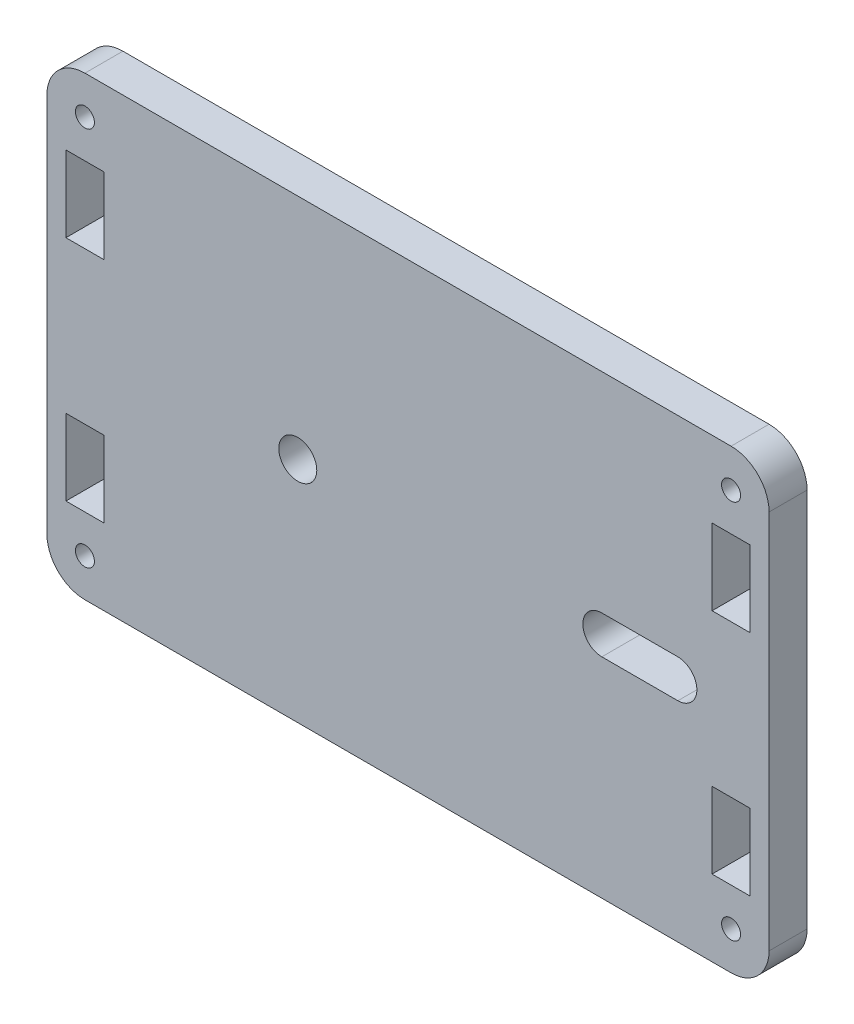
ISO-10303-21;
HEADER;
FILE_DESCRIPTION(('STEP AP214'),'2;1');
FILE_NAME('part.step','',(''),(''),'','','');
FILE_SCHEMA(('AUTOMOTIVE_DESIGN { 1 0 10303 214 1 1 1 1 }'));
ENDSEC;
DATA;
#1=APPLICATION_CONTEXT('core data for automotive mechanical design processes');
#2=APPLICATION_PROTOCOL_DEFINITION('international standard','automotive_design',2000,#1);
#3=PRODUCT_CONTEXT('',#1,'mechanical');
#4=PRODUCT('Part','Part','',(#3));
#5=PRODUCT_RELATED_PRODUCT_CATEGORY('part','',(#4));
#6=PRODUCT_DEFINITION_FORMATION('','',#4);
#7=PRODUCT_DEFINITION_CONTEXT('part definition',#1,'design');
#8=PRODUCT_DEFINITION('design','',#6,#7);
#9=PRODUCT_DEFINITION_SHAPE('','',#8);
#10=(LENGTH_UNIT() NAMED_UNIT(*) SI_UNIT(.MILLI.,.METRE.));
#11=(NAMED_UNIT(*) PLANE_ANGLE_UNIT() SI_UNIT($,.RADIAN.));
#12=(NAMED_UNIT(*) SI_UNIT($,.STERADIAN.) SOLID_ANGLE_UNIT());
#13=UNCERTAINTY_MEASURE_WITH_UNIT(LENGTH_MEASURE(1.E-05),#10,'distance_accuracy_value','');
#14=(GEOMETRIC_REPRESENTATION_CONTEXT(3) GLOBAL_UNCERTAINTY_ASSIGNED_CONTEXT((#13)) GLOBAL_UNIT_ASSIGNED_CONTEXT((#10,
#11,#12)) REPRESENTATION_CONTEXT('',''));
#15=CARTESIAN_POINT('',(0.,0.,0.));
#16=DIRECTION('',(0.,0.,1.));
#17=DIRECTION('',(1.,0.,0.));
#18=AXIS2_PLACEMENT_3D('',#15,#16,#17);
#19=CARTESIAN_POINT('',(-114.3,6.35,6.35));
#20=DIRECTION('',(0.,0.,-1.));
#21=DIRECTION('',(-1.,0.,0.));
#22=AXIS2_PLACEMENT_3D('',#19,#20,#21);
#23=CYLINDRICAL_SURFACE('',#22,6.34999999999999);
#24=CARTESIAN_POINT('',(-114.3,6.35,0.));
#25=DIRECTION('',(0.,0.,1.));
#26=DIRECTION('',(1.,0.,0.));
#27=AXIS2_PLACEMENT_3D('',#24,#25,#26);
#28=CIRCLE('',#27,6.34999999999999);
#29=CARTESIAN_POINT('',(-120.65,6.35,0.));
#30=VERTEX_POINT('',#29);
#31=CARTESIAN_POINT('',(-114.3,0.,0.));
#32=VERTEX_POINT('',#31);
#33=EDGE_CURVE('E532',#30,#32,#28,.T.);
#34=ORIENTED_EDGE('',*,*,#33,.T.);
#35=DIRECTION('',(0.,0.,-1.));
#36=VECTOR('',#35,1.);
#37=CARTESIAN_POINT('',(-114.3,0.,6.35));
#38=LINE('',#37,#36);
#39=CARTESIAN_POINT('',(-114.3,0.,6.35));
#40=VERTEX_POINT('',#39);
#41=EDGE_CURVE('E10',#40,#32,#38,.T.);
#42=ORIENTED_EDGE('',*,*,#41,.F.);
#43=CARTESIAN_POINT('',(-114.3,6.35,6.35));
#44=DIRECTION('',(0.,0.,1.));
#45=DIRECTION('',(1.,0.,0.));
#46=AXIS2_PLACEMENT_3D('',#43,#44,#45);
#47=CIRCLE('',#46,6.34999999999999);
#48=CARTESIAN_POINT('',(-120.65,6.35,6.35));
#49=VERTEX_POINT('',#48);
#50=EDGE_CURVE('E533',#49,#40,#47,.T.);
#51=ORIENTED_EDGE('',*,*,#50,.F.);
#52=DIRECTION('',(0.,0.,-1.));
#53=VECTOR('',#52,1.);
#54=CARTESIAN_POINT('',(-120.65,6.35,6.35));
#55=LINE('',#54,#53);
#56=EDGE_CURVE('E559',#49,#30,#55,.T.);
#57=ORIENTED_EDGE('',*,*,#56,.T.);
#58=EDGE_LOOP('',(#34,#42,#51,#57));
#59=FACE_BOUND('',#58,.T.);
#60=ADVANCED_FACE('F18',(#59),#23,.T.);
#61=CARTESIAN_POINT('',(-114.3,0.,6.35));
#62=DIRECTION('',(0.,1.,0.));
#63=DIRECTION('',(0.,0.,1.));
#64=AXIS2_PLACEMENT_3D('',#61,#62,#63);
#65=PLANE('',#64);
#66=DIRECTION('',(1.,0.,0.));
#67=VECTOR('',#66,1.);
#68=CARTESIAN_POINT('',(-114.3,0.,0.));
#69=LINE('',#68,#67);
#70=CARTESIAN_POINT('',(-6.35,0.,0.));
#71=VERTEX_POINT('',#70);
#72=EDGE_CURVE('E563',#32,#71,#69,.T.);
#73=ORIENTED_EDGE('',*,*,#72,.T.);
#74=DIRECTION('',(0.,0.,-1.));
#75=VECTOR('',#74,1.);
#76=CARTESIAN_POINT('',(-6.35,0.,6.35));
#77=LINE('',#76,#75);
#78=CARTESIAN_POINT('',(-6.35,0.,6.35));
#79=VERTEX_POINT('',#78);
#80=EDGE_CURVE('E26',#79,#71,#77,.T.);
#81=ORIENTED_EDGE('',*,*,#80,.F.);
#82=DIRECTION('',(1.,0.,0.));
#83=VECTOR('',#82,1.);
#84=CARTESIAN_POINT('',(-114.3,0.,6.35));
#85=LINE('',#84,#83);
#86=EDGE_CURVE('E537',#40,#79,#85,.T.);
#87=ORIENTED_EDGE('',*,*,#86,.F.);
#88=ORIENTED_EDGE('',*,*,#41,.T.);
#89=EDGE_LOOP('',(#73,#81,#87,#88));
#90=FACE_BOUND('',#89,.T.);
#91=ADVANCED_FACE('F635',(#90),#65,.F.);
#92=CARTESIAN_POINT('',(-6.34999999999999,6.35,6.35));
#93=DIRECTION('',(0.,0.,-1.));
#94=DIRECTION('',(-1.,0.,0.));
#95=AXIS2_PLACEMENT_3D('',#92,#93,#94);
#96=CYLINDRICAL_SURFACE('',#95,6.35);
#97=CARTESIAN_POINT('',(-6.34999999999999,6.35,0.));
#98=DIRECTION('',(0.,0.,1.));
#99=DIRECTION('',(1.,0.,0.));
#100=AXIS2_PLACEMENT_3D('',#97,#98,#99);
#101=CIRCLE('',#100,6.35);
#102=CARTESIAN_POINT('',(0.,6.35,0.));
#103=VERTEX_POINT('',#102);
#104=EDGE_CURVE('E566',#71,#103,#101,.T.);
#105=ORIENTED_EDGE('',*,*,#104,.T.);
#106=DIRECTION('',(0.,0.,-1.));
#107=VECTOR('',#106,1.);
#108=CARTESIAN_POINT('',(0.,6.35,6.35));
#109=LINE('',#108,#107);
#110=CARTESIAN_POINT('',(0.,6.35,6.35));
#111=VERTEX_POINT('',#110);
#112=EDGE_CURVE('E602',#111,#103,#109,.T.);
#113=ORIENTED_EDGE('',*,*,#112,.F.);
#114=CARTESIAN_POINT('',(-6.34999999999999,6.35,6.35));
#115=DIRECTION('',(0.,0.,1.));
#116=DIRECTION('',(1.,0.,0.));
#117=AXIS2_PLACEMENT_3D('',#114,#115,#116);
#118=CIRCLE('',#117,6.35);
#119=EDGE_CURVE('E541',#79,#111,#118,.T.);
#120=ORIENTED_EDGE('',*,*,#119,.F.);
#121=ORIENTED_EDGE('',*,*,#80,.T.);
#122=EDGE_LOOP('',(#105,#113,#120,#121));
#123=FACE_BOUND('',#122,.T.);
#124=ADVANCED_FACE('F613',(#123),#96,.T.);
#125=CARTESIAN_POINT('',(0.,69.85,6.35));
#126=DIRECTION('',(-1.,0.,0.));
#127=DIRECTION('',(0.,-1.,0.));
#128=AXIS2_PLACEMENT_3D('',#125,#126,#127);
#129=PLANE('',#128);
#130=DIRECTION('',(0.,1.,0.));
#131=VECTOR('',#130,1.);
#132=CARTESIAN_POINT('',(0.,69.85,0.));
#133=LINE('',#132,#131);
#134=CARTESIAN_POINT('',(0.,69.85,0.));
#135=VERTEX_POINT('',#134);
#136=EDGE_CURVE('E569',#103,#135,#133,.T.);
#137=ORIENTED_EDGE('',*,*,#136,.T.);
#138=DIRECTION('',(0.,0.,-1.));
#139=VECTOR('',#138,1.);
#140=CARTESIAN_POINT('',(0.,69.85,6.35));
#141=LINE('',#140,#139);
#142=CARTESIAN_POINT('',(0.,69.85,6.35));
#143=VERTEX_POINT('',#142);
#144=EDGE_CURVE('E598',#143,#135,#141,.T.);
#145=ORIENTED_EDGE('',*,*,#144,.F.);
#146=DIRECTION('',(0.,1.,0.));
#147=VECTOR('',#146,1.);
#148=CARTESIAN_POINT('',(0.,69.85,6.35));
#149=LINE('',#148,#147);
#150=EDGE_CURVE('E544',#111,#143,#149,.T.);
#151=ORIENTED_EDGE('',*,*,#150,.F.);
#152=ORIENTED_EDGE('',*,*,#112,.T.);
#153=EDGE_LOOP('',(#137,#145,#151,#152));
#154=FACE_BOUND('',#153,.T.);
#155=ADVANCED_FACE('F624',(#154),#129,.F.);
#156=CARTESIAN_POINT('',(-6.34999999999999,69.85,6.35));
#157=DIRECTION('',(0.,0.,-1.));
#158=DIRECTION('',(-1.,0.,0.));
#159=AXIS2_PLACEMENT_3D('',#156,#157,#158);
#160=CYLINDRICAL_SURFACE('',#159,6.35);
#161=CARTESIAN_POINT('',(-6.34999999999999,69.85,0.));
#162=DIRECTION('',(0.,0.,1.));
#163=DIRECTION('',(-1.,0.,0.));
#164=AXIS2_PLACEMENT_3D('',#161,#162,#163);
#165=CIRCLE('',#164,6.35);
#166=CARTESIAN_POINT('',(-6.34999999999999,76.2,0.));
#167=VERTEX_POINT('',#166);
#168=EDGE_CURVE('E572',#135,#167,#165,.T.);
#169=ORIENTED_EDGE('',*,*,#168,.T.);
#170=DIRECTION('',(0.,0.,-1.));
#171=VECTOR('',#170,1.);
#172=CARTESIAN_POINT('',(-6.34999999999999,76.2,6.35));
#173=LINE('',#172,#171);
#174=CARTESIAN_POINT('',(-6.34999999999999,76.2,6.35));
#175=VERTEX_POINT('',#174);
#176=EDGE_CURVE('E594',#175,#167,#173,.T.);
#177=ORIENTED_EDGE('',*,*,#176,.F.);
#178=CARTESIAN_POINT('',(-6.34999999999999,69.85,6.35));
#179=DIRECTION('',(0.,0.,1.));
#180=DIRECTION('',(-1.,0.,0.));
#181=AXIS2_PLACEMENT_3D('',#178,#179,#180);
#182=CIRCLE('',#181,6.35);
#183=EDGE_CURVE('E547',#143,#175,#182,.T.);
#184=ORIENTED_EDGE('',*,*,#183,.F.);
#185=ORIENTED_EDGE('',*,*,#144,.T.);
#186=EDGE_LOOP('',(#169,#177,#184,#185));
#187=FACE_BOUND('',#186,.T.);
#188=ADVANCED_FACE('F628',(#187),#160,.T.);
#189=CARTESIAN_POINT('',(-114.3,76.2,6.35));
#190=DIRECTION('',(0.,-1.,0.));
#191=DIRECTION('',(1.,0.,0.));
#192=AXIS2_PLACEMENT_3D('',#189,#190,#191);
#193=PLANE('',#192);
#194=DIRECTION('',(-1.,0.,0.));
#195=VECTOR('',#194,1.);
#196=CARTESIAN_POINT('',(-114.3,76.2,0.));
#197=LINE('',#196,#195);
#198=CARTESIAN_POINT('',(-114.3,76.2,0.));
#199=VERTEX_POINT('',#198);
#200=EDGE_CURVE('E575',#167,#199,#197,.T.);
#201=ORIENTED_EDGE('',*,*,#200,.T.);
#202=DIRECTION('',(0.,0.,-1.));
#203=VECTOR('',#202,1.);
#204=CARTESIAN_POINT('',(-114.3,76.2,6.35));
#205=LINE('',#204,#203);
#206=CARTESIAN_POINT('',(-114.3,76.2,6.35));
#207=VERTEX_POINT('',#206);
#208=EDGE_CURVE('E590',#207,#199,#205,.T.);
#209=ORIENTED_EDGE('',*,*,#208,.F.);
#210=DIRECTION('',(-1.,0.,0.));
#211=VECTOR('',#210,1.);
#212=CARTESIAN_POINT('',(-114.3,76.2,6.35));
#213=LINE('',#212,#211);
#214=EDGE_CURVE('E550',#175,#207,#213,.T.);
#215=ORIENTED_EDGE('',*,*,#214,.F.);
#216=ORIENTED_EDGE('',*,*,#176,.T.);
#217=EDGE_LOOP('',(#201,#209,#215,#216));
#218=FACE_BOUND('',#217,.T.);
#219=ADVANCED_FACE('F648',(#218),#193,.F.);
#220=CARTESIAN_POINT('',(-114.3,69.85,6.35));
#221=DIRECTION('',(0.,0.,-1.));
#222=DIRECTION('',(-1.,0.,0.));
#223=AXIS2_PLACEMENT_3D('',#220,#221,#222);
#224=CYLINDRICAL_SURFACE('',#223,6.34999999999999);
#225=CARTESIAN_POINT('',(-114.3,69.85,0.));
#226=DIRECTION('',(0.,0.,1.));
#227=DIRECTION('',(1.,0.,0.));
#228=AXIS2_PLACEMENT_3D('',#225,#226,#227);
#229=CIRCLE('',#228,6.34999999999999);
#230=CARTESIAN_POINT('',(-120.65,69.85,0.));
#231=VERTEX_POINT('',#230);
#232=EDGE_CURVE('E578',#199,#231,#229,.T.);
#233=ORIENTED_EDGE('',*,*,#232,.T.);
#234=DIRECTION('',(0.,0.,-1.));
#235=VECTOR('',#234,1.);
#236=CARTESIAN_POINT('',(-120.65,69.85,6.35));
#237=LINE('',#236,#235);
#238=CARTESIAN_POINT('',(-120.65,69.85,6.35));
#239=VERTEX_POINT('',#238);
#240=EDGE_CURVE('E586',#239,#231,#237,.T.);
#241=ORIENTED_EDGE('',*,*,#240,.F.);
#242=CARTESIAN_POINT('',(-114.3,69.85,6.35));
#243=DIRECTION('',(0.,0.,1.));
#244=DIRECTION('',(1.,0.,0.));
#245=AXIS2_PLACEMENT_3D('',#242,#243,#244);
#246=CIRCLE('',#245,6.34999999999999);
#247=EDGE_CURVE('E553',#207,#239,#246,.T.);
#248=ORIENTED_EDGE('',*,*,#247,.F.);
#249=ORIENTED_EDGE('',*,*,#208,.T.);
#250=EDGE_LOOP('',(#233,#241,#248,#249));
#251=FACE_BOUND('',#250,.T.);
#252=ADVANCED_FACE('F646',(#251),#224,.T.);
#253=CARTESIAN_POINT('',(-120.65,69.85,6.35));
#254=DIRECTION('',(1.,0.,0.));
#255=DIRECTION('',(0.,1.,0.));
#256=AXIS2_PLACEMENT_3D('',#253,#254,#255);
#257=PLANE('',#256);
#258=DIRECTION('',(0.,-1.,0.));
#259=VECTOR('',#258,1.);
#260=CARTESIAN_POINT('',(-120.65,69.85,0.));
#261=LINE('',#260,#259);
#262=EDGE_CURVE('E538',#231,#30,#261,.T.);
#263=ORIENTED_EDGE('',*,*,#262,.T.);
#264=ORIENTED_EDGE('',*,*,#56,.F.);
#265=DIRECTION('',(0.,-1.,0.));
#266=VECTOR('',#265,1.);
#267=CARTESIAN_POINT('',(-120.65,69.85,6.35));
#268=LINE('',#267,#266);
#269=EDGE_CURVE('E556',#239,#49,#268,.T.);
#270=ORIENTED_EDGE('',*,*,#269,.F.);
#271=ORIENTED_EDGE('',*,*,#240,.T.);
#272=EDGE_LOOP('',(#263,#264,#270,#271));
#273=FACE_BOUND('',#272,.T.);
#274=ADVANCED_FACE('F641',(#273),#257,.F.);
#275=CARTESIAN_POINT('',(-114.3,6.35,6.35));
#276=DIRECTION('',(0.,0.,1.));
#277=DIRECTION('',(1.,0.,0.));
#278=AXIS2_PLACEMENT_3D('',#275,#276,#277);
#279=PLANE('',#278);
#280=DIRECTION('',(1.,0.,0.));
#281=VECTOR('',#280,1.);
#282=CARTESIAN_POINT('',(-111.125,25.4,6.35));
#283=LINE('',#282,#281);
#284=CARTESIAN_POINT('',(-117.475,25.4,6.35));
#285=VERTEX_POINT('',#284);
#286=CARTESIAN_POINT('',(-111.125,25.4,6.35));
#287=VERTEX_POINT('',#286);
#288=EDGE_CURVE('E449',#285,#287,#283,.T.);
#289=ORIENTED_EDGE('',*,*,#288,.T.);
#290=DIRECTION('',(0.,-1.,0.));
#291=VECTOR('',#290,1.);
#292=CARTESIAN_POINT('',(-111.125,25.4,6.35));
#293=LINE('',#292,#291);
#294=CARTESIAN_POINT('',(-111.125,12.7,6.35));
#295=VERTEX_POINT('',#294);
#296=EDGE_CURVE('E415',#287,#295,#293,.T.);
#297=ORIENTED_EDGE('',*,*,#296,.T.);
#298=DIRECTION('',(-1.,0.,0.));
#299=VECTOR('',#298,1.);
#300=CARTESIAN_POINT('',(-111.125,12.7,6.35));
#301=LINE('',#300,#299);
#302=CARTESIAN_POINT('',(-117.475,12.7,6.35));
#303=VERTEX_POINT('',#302);
#304=EDGE_CURVE('E37',#295,#303,#301,.T.);
#305=ORIENTED_EDGE('',*,*,#304,.T.);
#306=DIRECTION('',(0.,1.,0.));
#307=VECTOR('',#306,1.);
#308=CARTESIAN_POINT('',(-117.475,25.4,6.35));
#309=LINE('',#308,#307);
#310=EDGE_CURVE('E443',#303,#285,#309,.T.);
#311=ORIENTED_EDGE('',*,*,#310,.T.);
#312=EDGE_LOOP('',(#289,#297,#305,#311));
#313=FACE_BOUND('',#312,.T.);
#314=DIRECTION('',(1.,0.,0.));
#315=VECTOR('',#314,1.);
#316=CARTESIAN_POINT('',(-3.175,63.5,6.35));
#317=LINE('',#316,#315);
#318=CARTESIAN_POINT('',(-9.525,63.5,6.35));
#319=VERTEX_POINT('',#318);
#320=CARTESIAN_POINT('',(-3.175,63.5,6.35));
#321=VERTEX_POINT('',#320);
#322=EDGE_CURVE('E416',#319,#321,#317,.T.);
#323=ORIENTED_EDGE('',*,*,#322,.T.);
#324=DIRECTION('',(0.,-1.,0.));
#325=VECTOR('',#324,1.);
#326=CARTESIAN_POINT('',(-3.175,63.5,6.35));
#327=LINE('',#326,#325);
#328=CARTESIAN_POINT('',(-3.17499999999999,50.8,6.35));
#329=VERTEX_POINT('',#328);
#330=EDGE_CURVE('E456',#321,#329,#327,.T.);
#331=ORIENTED_EDGE('',*,*,#330,.T.);
#332=DIRECTION('',(-1.,0.,0.));
#333=VECTOR('',#332,1.);
#334=CARTESIAN_POINT('',(-3.175,50.8,6.35));
#335=LINE('',#334,#333);
#336=CARTESIAN_POINT('',(-9.52500000000001,50.8,6.35));
#337=VERTEX_POINT('',#336);
#338=EDGE_CURVE('E47',#329,#337,#335,.T.);
#339=ORIENTED_EDGE('',*,*,#338,.T.);
#340=DIRECTION('',(0.,1.,0.));
#341=VECTOR('',#340,1.);
#342=CARTESIAN_POINT('',(-9.525,63.5,6.35));
#343=LINE('',#342,#341);
#344=EDGE_CURVE('E483',#337,#319,#343,.T.);
#345=ORIENTED_EDGE('',*,*,#344,.T.);
#346=EDGE_LOOP('',(#323,#331,#339,#345));
#347=FACE_BOUND('',#346,.T.);
#348=DIRECTION('',(1.,0.,0.));
#349=VECTOR('',#348,1.);
#350=CARTESIAN_POINT('',(-3.175,25.4,6.35));
#351=LINE('',#350,#349);
#352=CARTESIAN_POINT('',(-9.525,25.4,6.35));
#353=VERTEX_POINT('',#352);
#354=CARTESIAN_POINT('',(-3.175,25.4,6.35));
#355=VERTEX_POINT('',#354);
#356=EDGE_CURVE('E365',#353,#355,#351,.T.);
#357=ORIENTED_EDGE('',*,*,#356,.T.);
#358=DIRECTION('',(0.,-1.,0.));
#359=VECTOR('',#358,1.);
#360=CARTESIAN_POINT('',(-3.175,25.4,6.35));
#361=LINE('',#360,#359);
#362=CARTESIAN_POINT('',(-3.17500000000001,12.7,6.35));
#363=VERTEX_POINT('',#362);
#364=EDGE_CURVE('E327',#355,#363,#361,.T.);
#365=ORIENTED_EDGE('',*,*,#364,.T.);
#366=DIRECTION('',(-1.,0.,0.));
#367=VECTOR('',#366,1.);
#368=CARTESIAN_POINT('',(-3.17500000000001,12.7,6.35));
#369=LINE('',#368,#367);
#370=CARTESIAN_POINT('',(-9.52500000000001,12.7,6.35));
#371=VERTEX_POINT('',#370);
#372=EDGE_CURVE('E347',#363,#371,#369,.T.);
#373=ORIENTED_EDGE('',*,*,#372,.T.);
#374=DIRECTION('',(0.,1.,0.));
#375=VECTOR('',#374,1.);
#376=CARTESIAN_POINT('',(-9.525,25.4,6.35));
#377=LINE('',#376,#375);
#378=EDGE_CURVE('E358',#371,#353,#377,.T.);
#379=ORIENTED_EDGE('',*,*,#378,.T.);
#380=EDGE_LOOP('',(#357,#365,#373,#379));
#381=FACE_BOUND('',#380,.T.);
#382=DIRECTION('',(1.,0.,0.));
#383=VECTOR('',#382,1.);
#384=CARTESIAN_POINT('',(-111.125,63.5,6.35));
#385=LINE('',#384,#383);
#386=CARTESIAN_POINT('',(-117.475,63.5,6.35));
#387=VERTEX_POINT('',#386);
#388=CARTESIAN_POINT('',(-111.125,63.5,6.35));
#389=VERTEX_POINT('',#388);
#390=EDGE_CURVE('E328',#387,#389,#385,.T.);
#391=ORIENTED_EDGE('',*,*,#390,.T.);
#392=DIRECTION('',(0.,-1.,0.));
#393=VECTOR('',#392,1.);
#394=CARTESIAN_POINT('',(-111.125,63.5,6.35));
#395=LINE('',#394,#393);
#396=CARTESIAN_POINT('',(-111.125,50.8,6.35));
#397=VERTEX_POINT('',#396);
#398=EDGE_CURVE('E372',#389,#397,#395,.T.);
#399=ORIENTED_EDGE('',*,*,#398,.T.);
#400=DIRECTION('',(-1.,0.,0.));
#401=VECTOR('',#400,1.);
#402=CARTESIAN_POINT('',(-111.125,50.8,6.35));
#403=LINE('',#402,#401);
#404=CARTESIAN_POINT('',(-117.475,50.8,6.35));
#405=VERTEX_POINT('',#404);
#406=EDGE_CURVE('E391',#397,#405,#403,.T.);
#407=ORIENTED_EDGE('',*,*,#406,.T.);
#408=DIRECTION('',(0.,1.,0.));
#409=VECTOR('',#408,1.);
#410=CARTESIAN_POINT('',(-117.475,63.5,6.35));
#411=LINE('',#410,#409);
#412=EDGE_CURVE('E402',#405,#387,#411,.T.);
#413=ORIENTED_EDGE('',*,*,#412,.T.);
#414=EDGE_LOOP('',(#391,#399,#407,#413));
#415=FACE_BOUND('',#414,.T.);
#416=CARTESIAN_POINT('',(-78.74,38.1,6.35));
#417=DIRECTION('',(0.,0.,1.));
#418=DIRECTION('',(1.,0.,0.));
#419=AXIS2_PLACEMENT_3D('',#416,#417,#418);
#420=CIRCLE('',#419,3.175);
#421=CARTESIAN_POINT('',(-75.565,38.1,6.35));
#422=VERTEX_POINT('',#421);
#423=EDGE_CURVE('E513',#422,#422,#420,.T.);
#424=ORIENTED_EDGE('',*,*,#423,.F.);
#425=EDGE_LOOP('',(#424));
#426=FACE_BOUND('',#425,.T.);
#427=CARTESIAN_POINT('',(-114.3,6.35,6.35));
#428=DIRECTION('',(0.,0.,1.));
#429=DIRECTION('',(1.,0.,0.));
#430=AXIS2_PLACEMENT_3D('',#427,#428,#429);
#431=CIRCLE('',#430,1.5875);
#432=CARTESIAN_POINT('',(-112.7125,6.35,6.35));
#433=VERTEX_POINT('',#432);
#434=EDGE_CURVE('E514',#433,#433,#431,.T.);
#435=ORIENTED_EDGE('',*,*,#434,.F.);
#436=EDGE_LOOP('',(#435));
#437=FACE_BOUND('',#436,.T.);
#438=CARTESIAN_POINT('',(-114.3,69.85,6.35));
#439=DIRECTION('',(0.,0.,1.));
#440=DIRECTION('',(1.,0.,0.));
#441=AXIS2_PLACEMENT_3D('',#438,#439,#440);
#442=CIRCLE('',#441,1.58749999999999);
#443=CARTESIAN_POINT('',(-112.7125,69.85,6.35));
#444=VERTEX_POINT('',#443);
#445=EDGE_CURVE('E497',#444,#444,#442,.T.);
#446=ORIENTED_EDGE('',*,*,#445,.F.);
#447=EDGE_LOOP('',(#446));
#448=FACE_BOUND('',#447,.T.);
#449=CARTESIAN_POINT('',(-6.34999999999999,6.35,6.35));
#450=DIRECTION('',(0.,0.,1.));
#451=DIRECTION('',(1.,0.,0.));
#452=AXIS2_PLACEMENT_3D('',#449,#450,#451);
#453=CIRCLE('',#452,1.5875);
#454=CARTESIAN_POINT('',(-4.76249999999999,6.35,6.35));
#455=VERTEX_POINT('',#454);
#456=EDGE_CURVE('E498',#455,#455,#453,.T.);
#457=ORIENTED_EDGE('',*,*,#456,.F.);
#458=EDGE_LOOP('',(#457));
#459=FACE_BOUND('',#458,.T.);
#460=DIRECTION('',(-1.,0.,0.));
#461=VECTOR('',#460,1.);
#462=CARTESIAN_POINT('',(0.,41.275,6.35));
#463=LINE('',#462,#461);
#464=CARTESIAN_POINT('',(-15.24,41.275,6.35));
#465=VERTEX_POINT('',#464);
#466=CARTESIAN_POINT('',(-27.94,41.275,6.35));
#467=VERTEX_POINT('',#466);
#468=EDGE_CURVE('E317',#465,#467,#463,.T.);
#469=ORIENTED_EDGE('',*,*,#468,.F.);
#470=CARTESIAN_POINT('',(-15.24,38.1,6.35));
#471=DIRECTION('',(0.,0.,1.));
#472=DIRECTION('',(1.,0.,0.));
#473=AXIS2_PLACEMENT_3D('',#470,#471,#472);
#474=CIRCLE('',#473,3.175);
#475=CARTESIAN_POINT('',(-15.24,34.925,6.35));
#476=VERTEX_POINT('',#475);
#477=EDGE_CURVE('E291',#476,#465,#474,.T.);
#478=ORIENTED_EDGE('',*,*,#477,.F.);
#479=DIRECTION('',(1.,0.,0.));
#480=VECTOR('',#479,1.);
#481=CARTESIAN_POINT('',(0.,34.925,6.35));
#482=LINE('',#481,#480);
#483=CARTESIAN_POINT('',(-27.94,34.925,6.35));
#484=VERTEX_POINT('',#483);
#485=EDGE_CURVE('E282',#484,#476,#482,.T.);
#486=ORIENTED_EDGE('',*,*,#485,.F.);
#487=CARTESIAN_POINT('',(-27.94,38.1,6.35));
#488=DIRECTION('',(0.,0.,1.));
#489=DIRECTION('',(1.,0.,0.));
#490=AXIS2_PLACEMENT_3D('',#487,#488,#489);
#491=CIRCLE('',#490,3.175);
#492=EDGE_CURVE('E267',#467,#484,#491,.T.);
#493=ORIENTED_EDGE('',*,*,#492,.F.);
#494=EDGE_LOOP('',(#469,#478,#486,#493));
#495=FACE_BOUND('',#494,.T.);
#496=CARTESIAN_POINT('',(-6.34999999999999,69.85,6.35));
#497=DIRECTION('',(0.,0.,1.));
#498=DIRECTION('',(1.,0.,0.));
#499=AXIS2_PLACEMENT_3D('',#496,#497,#498);
#500=CIRCLE('',#499,1.5875);
#501=CARTESIAN_POINT('',(-4.76249999999999,69.85,6.35));
#502=VERTEX_POINT('',#501);
#503=EDGE_CURVE('E528',#502,#502,#500,.T.);
#504=ORIENTED_EDGE('',*,*,#503,.F.);
#505=EDGE_LOOP('',(#504));
#506=FACE_BOUND('',#505,.T.);
#507=ORIENTED_EDGE('',*,*,#50,.T.);
#508=ORIENTED_EDGE('',*,*,#86,.T.);
#509=ORIENTED_EDGE('',*,*,#119,.T.);
#510=ORIENTED_EDGE('',*,*,#150,.T.);
#511=ORIENTED_EDGE('',*,*,#183,.T.);
#512=ORIENTED_EDGE('',*,*,#214,.T.);
#513=ORIENTED_EDGE('',*,*,#247,.T.);
#514=ORIENTED_EDGE('',*,*,#269,.T.);
#515=EDGE_LOOP('',(#507,#508,#509,#510,#511,#512,#513,#514));
#516=FACE_BOUND('',#515,.T.);
#517=ADVANCED_FACE('F289',(#313,#347,#381,#415,#426,#437,#448,#459,#495,#506,#516),#279,.T.);
#518=CARTESIAN_POINT('',(-114.3,6.35,0.));
#519=DIRECTION('',(0.,0.,1.));
#520=DIRECTION('',(1.,0.,0.));
#521=AXIS2_PLACEMENT_3D('',#518,#519,#520);
#522=PLANE('',#521);
#523=DIRECTION('',(0.,-1.,0.));
#524=VECTOR('',#523,1.);
#525=CARTESIAN_POINT('',(-111.125,25.4,0.));
#526=LINE('',#525,#524);
#527=CARTESIAN_POINT('',(-111.125,25.4,0.));
#528=VERTEX_POINT('',#527);
#529=CARTESIAN_POINT('',(-111.125,12.7,0.));
#530=VERTEX_POINT('',#529);
#531=EDGE_CURVE('E412',#528,#530,#526,.T.);
#532=ORIENTED_EDGE('',*,*,#531,.F.);
#533=DIRECTION('',(1.,0.,0.));
#534=VECTOR('',#533,1.);
#535=CARTESIAN_POINT('',(-111.125,25.4,0.));
#536=LINE('',#535,#534);
#537=CARTESIAN_POINT('',(-117.475,25.4,0.));
#538=VERTEX_POINT('',#537);
#539=EDGE_CURVE('E447',#538,#528,#536,.T.);
#540=ORIENTED_EDGE('',*,*,#539,.F.);
#541=DIRECTION('',(0.,1.,0.));
#542=VECTOR('',#541,1.);
#543=CARTESIAN_POINT('',(-117.475,25.4,0.));
#544=LINE('',#543,#542);
#545=CARTESIAN_POINT('',(-117.475,12.7,0.));
#546=VERTEX_POINT('',#545);
#547=EDGE_CURVE('E436',#546,#538,#544,.T.);
#548=ORIENTED_EDGE('',*,*,#547,.F.);
#549=DIRECTION('',(-1.,0.,0.));
#550=VECTOR('',#549,1.);
#551=CARTESIAN_POINT('',(-111.125,12.7,0.));
#552=LINE('',#551,#550);
#553=EDGE_CURVE('E427',#530,#546,#552,.T.);
#554=ORIENTED_EDGE('',*,*,#553,.F.);
#555=EDGE_LOOP('',(#532,#540,#548,#554));
#556=FACE_BOUND('',#555,.T.);
#557=DIRECTION('',(0.,-1.,0.));
#558=VECTOR('',#557,1.);
#559=CARTESIAN_POINT('',(-3.175,63.5,0.));
#560=LINE('',#559,#558);
#561=CARTESIAN_POINT('',(-3.17499999999999,63.5,0.));
#562=VERTEX_POINT('',#561);
#563=CARTESIAN_POINT('',(-3.175,50.8,0.));
#564=VERTEX_POINT('',#563);
#565=EDGE_CURVE('E369',#562,#564,#560,.T.);
#566=ORIENTED_EDGE('',*,*,#565,.F.);
#567=DIRECTION('',(1.,0.,0.));
#568=VECTOR('',#567,1.);
#569=CARTESIAN_POINT('',(-3.175,63.5,0.));
#570=LINE('',#569,#568);
#571=CARTESIAN_POINT('',(-9.525,63.5,0.));
#572=VERTEX_POINT('',#571);
#573=EDGE_CURVE('E487',#572,#562,#570,.T.);
#574=ORIENTED_EDGE('',*,*,#573,.F.);
#575=DIRECTION('',(0.,1.,0.));
#576=VECTOR('',#575,1.);
#577=CARTESIAN_POINT('',(-9.525,63.5,0.));
#578=LINE('',#577,#576);
#579=CARTESIAN_POINT('',(-9.525,50.8,0.));
#580=VERTEX_POINT('',#579);
#581=EDGE_CURVE('E476',#580,#572,#578,.T.);
#582=ORIENTED_EDGE('',*,*,#581,.F.);
#583=DIRECTION('',(-1.,0.,0.));
#584=VECTOR('',#583,1.);
#585=CARTESIAN_POINT('',(-3.175,50.8,0.));
#586=LINE('',#585,#584);
#587=EDGE_CURVE('E467',#564,#580,#586,.T.);
#588=ORIENTED_EDGE('',*,*,#587,.F.);
#589=EDGE_LOOP('',(#566,#574,#582,#588));
#590=FACE_BOUND('',#589,.T.);
#591=DIRECTION('',(0.,-1.,0.));
#592=VECTOR('',#591,1.);
#593=CARTESIAN_POINT('',(-3.175,25.4,0.));
#594=LINE('',#593,#592);
#595=CARTESIAN_POINT('',(-3.17500000000001,25.4,0.));
#596=VERTEX_POINT('',#595);
#597=CARTESIAN_POINT('',(-3.17500000000001,12.7,0.));
#598=VERTEX_POINT('',#597);
#599=EDGE_CURVE('E324',#596,#598,#594,.T.);
#600=ORIENTED_EDGE('',*,*,#599,.F.);
#601=DIRECTION('',(1.,0.,0.));
#602=VECTOR('',#601,1.);
#603=CARTESIAN_POINT('',(-3.175,25.4,0.));
#604=LINE('',#603,#602);
#605=CARTESIAN_POINT('',(-9.525,25.4,0.));
#606=VERTEX_POINT('',#605);
#607=EDGE_CURVE('E362',#606,#596,#604,.T.);
#608=ORIENTED_EDGE('',*,*,#607,.F.);
#609=DIRECTION('',(0.,1.,0.));
#610=VECTOR('',#609,1.);
#611=CARTESIAN_POINT('',(-9.525,25.4,0.));
#612=LINE('',#611,#610);
#613=CARTESIAN_POINT('',(-9.52500000000001,12.7,0.));
#614=VERTEX_POINT('',#613);
#615=EDGE_CURVE('E351',#614,#606,#612,.T.);
#616=ORIENTED_EDGE('',*,*,#615,.F.);
#617=DIRECTION('',(-1.,0.,0.));
#618=VECTOR('',#617,1.);
#619=CARTESIAN_POINT('',(-3.17500000000001,12.7,0.));
#620=LINE('',#619,#618);
#621=EDGE_CURVE('E340',#598,#614,#620,.T.);
#622=ORIENTED_EDGE('',*,*,#621,.F.);
#623=EDGE_LOOP('',(#600,#608,#616,#622));
#624=FACE_BOUND('',#623,.T.);
#625=DIRECTION('',(0.,-1.,0.));
#626=VECTOR('',#625,1.);
#627=CARTESIAN_POINT('',(-111.125,63.5,0.));
#628=LINE('',#627,#626);
#629=CARTESIAN_POINT('',(-111.125,63.5,0.));
#630=VERTEX_POINT('',#629);
#631=CARTESIAN_POINT('',(-111.125,50.8,0.));
#632=VERTEX_POINT('',#631);
#633=EDGE_CURVE('E323',#630,#632,#628,.T.);
#634=ORIENTED_EDGE('',*,*,#633,.F.);
#635=DIRECTION('',(1.,0.,0.));
#636=VECTOR('',#635,1.);
#637=CARTESIAN_POINT('',(-111.125,63.5,0.));
#638=LINE('',#637,#636);
#639=CARTESIAN_POINT('',(-117.475,63.5,0.));
#640=VERTEX_POINT('',#639);
#641=EDGE_CURVE('E406',#640,#630,#638,.T.);
#642=ORIENTED_EDGE('',*,*,#641,.F.);
#643=DIRECTION('',(0.,1.,0.));
#644=VECTOR('',#643,1.);
#645=CARTESIAN_POINT('',(-117.475,63.5,0.));
#646=LINE('',#645,#644);
#647=CARTESIAN_POINT('',(-117.475,50.8,0.));
#648=VERTEX_POINT('',#647);
#649=EDGE_CURVE('E395',#648,#640,#646,.T.);
#650=ORIENTED_EDGE('',*,*,#649,.F.);
#651=DIRECTION('',(-1.,0.,0.));
#652=VECTOR('',#651,1.);
#653=CARTESIAN_POINT('',(-111.125,50.8,0.));
#654=LINE('',#653,#652);
#655=EDGE_CURVE('E384',#632,#648,#654,.T.);
#656=ORIENTED_EDGE('',*,*,#655,.F.);
#657=EDGE_LOOP('',(#634,#642,#650,#656));
#658=FACE_BOUND('',#657,.T.);
#659=CARTESIAN_POINT('',(-78.74,38.1,0.));
#660=DIRECTION('',(0.,0.,1.));
#661=DIRECTION('',(1.,0.,0.));
#662=AXIS2_PLACEMENT_3D('',#659,#660,#661);
#663=CIRCLE('',#662,3.175);
#664=CARTESIAN_POINT('',(-75.565,38.1,0.));
#665=VERTEX_POINT('',#664);
#666=EDGE_CURVE('E509',#665,#665,#663,.T.);
#667=ORIENTED_EDGE('',*,*,#666,.T.);
#668=EDGE_LOOP('',(#667));
#669=FACE_BOUND('',#668,.T.);
#670=CARTESIAN_POINT('',(-114.3,6.35,0.));
#671=DIRECTION('',(0.,0.,1.));
#672=DIRECTION('',(1.,0.,0.));
#673=AXIS2_PLACEMENT_3D('',#670,#671,#672);
#674=CIRCLE('',#673,1.5875);
#675=CARTESIAN_POINT('',(-112.7125,6.35,0.));
#676=VERTEX_POINT('',#675);
#677=EDGE_CURVE('E502',#676,#676,#674,.T.);
#678=ORIENTED_EDGE('',*,*,#677,.T.);
#679=EDGE_LOOP('',(#678));
#680=FACE_BOUND('',#679,.T.);
#681=CARTESIAN_POINT('',(-114.3,69.85,0.));
#682=DIRECTION('',(0.,0.,1.));
#683=DIRECTION('',(1.,0.,0.));
#684=AXIS2_PLACEMENT_3D('',#681,#682,#683);
#685=CIRCLE('',#684,1.58749999999999);
#686=CARTESIAN_POINT('',(-112.7125,69.85,0.));
#687=VERTEX_POINT('',#686);
#688=EDGE_CURVE('E493',#687,#687,#685,.T.);
#689=ORIENTED_EDGE('',*,*,#688,.T.);
#690=EDGE_LOOP('',(#689));
#691=FACE_BOUND('',#690,.T.);
#692=CARTESIAN_POINT('',(-6.34999999999999,6.35,0.));
#693=DIRECTION('',(0.,0.,1.));
#694=DIRECTION('',(1.,0.,0.));
#695=AXIS2_PLACEMENT_3D('',#692,#693,#694);
#696=CIRCLE('',#695,1.5875);
#697=CARTESIAN_POINT('',(-4.76249999999999,6.35,0.));
#698=VERTEX_POINT('',#697);
#699=EDGE_CURVE('E453',#698,#698,#696,.T.);
#700=ORIENTED_EDGE('',*,*,#699,.T.);
#701=EDGE_LOOP('',(#700));
#702=FACE_BOUND('',#701,.T.);
#703=CARTESIAN_POINT('',(-15.24,38.1,0.));
#704=DIRECTION('',(0.,0.,1.));
#705=DIRECTION('',(1.,0.,0.));
#706=AXIS2_PLACEMENT_3D('',#703,#704,#705);
#707=CIRCLE('',#706,3.175);
#708=CARTESIAN_POINT('',(-15.24,34.925,0.));
#709=VERTEX_POINT('',#708);
#710=CARTESIAN_POINT('',(-15.24,41.275,0.));
#711=VERTEX_POINT('',#710);
#712=EDGE_CURVE('E313',#709,#711,#707,.T.);
#713=ORIENTED_EDGE('',*,*,#712,.T.);
#714=DIRECTION('',(-1.,0.,0.));
#715=VECTOR('',#714,1.);
#716=CARTESIAN_POINT('',(0.,41.275,0.));
#717=LINE('',#716,#715);
#718=CARTESIAN_POINT('',(-27.94,41.275,0.));
#719=VERTEX_POINT('',#718);
#720=EDGE_CURVE('E319',#711,#719,#717,.T.);
#721=ORIENTED_EDGE('',*,*,#720,.T.);
#722=CARTESIAN_POINT('',(-27.94,38.1,0.));
#723=DIRECTION('',(0.,0.,1.));
#724=DIRECTION('',(1.,0.,0.));
#725=AXIS2_PLACEMENT_3D('',#722,#723,#724);
#726=CIRCLE('',#725,3.175);
#727=CARTESIAN_POINT('',(-27.94,34.925,0.));
#728=VERTEX_POINT('',#727);
#729=EDGE_CURVE('E278',#719,#728,#726,.T.);
#730=ORIENTED_EDGE('',*,*,#729,.T.);
#731=DIRECTION('',(1.,0.,0.));
#732=VECTOR('',#731,1.);
#733=CARTESIAN_POINT('',(0.,34.925,0.));
#734=LINE('',#733,#732);
#735=EDGE_CURVE('E285',#728,#709,#734,.T.);
#736=ORIENTED_EDGE('',*,*,#735,.T.);
#737=EDGE_LOOP('',(#713,#721,#730,#736));
#738=FACE_BOUND('',#737,.T.);
#739=CARTESIAN_POINT('',(-6.34999999999999,69.85,0.));
#740=DIRECTION('',(0.,0.,1.));
#741=DIRECTION('',(1.,0.,0.));
#742=AXIS2_PLACEMENT_3D('',#739,#740,#741);
#743=CIRCLE('',#742,1.5875);
#744=CARTESIAN_POINT('',(-4.76249999999999,69.85,0.));
#745=VERTEX_POINT('',#744);
#746=EDGE_CURVE('E518',#745,#745,#743,.T.);
#747=ORIENTED_EDGE('',*,*,#746,.T.);
#748=EDGE_LOOP('',(#747));
#749=FACE_BOUND('',#748,.T.);
#750=ORIENTED_EDGE('',*,*,#33,.F.);
#751=ORIENTED_EDGE('',*,*,#262,.F.);
#752=ORIENTED_EDGE('',*,*,#232,.F.);
#753=ORIENTED_EDGE('',*,*,#200,.F.);
#754=ORIENTED_EDGE('',*,*,#168,.F.);
#755=ORIENTED_EDGE('',*,*,#136,.F.);
#756=ORIENTED_EDGE('',*,*,#104,.F.);
#757=ORIENTED_EDGE('',*,*,#72,.F.);
#758=EDGE_LOOP('',(#750,#751,#752,#753,#754,#755,#756,#757));
#759=FACE_BOUND('',#758,.T.);
#760=ADVANCED_FACE('F619',(#556,#590,#624,#658,#669,#680,#691,#702,#738,#749,#759),#522,.F.);
#761=CARTESIAN_POINT('',(-6.34999999999999,69.85,0.));
#762=DIRECTION('',(0.,0.,1.));
#763=DIRECTION('',(1.,0.,0.));
#764=AXIS2_PLACEMENT_3D('',#761,#762,#763);
#765=CYLINDRICAL_SURFACE('',#764,1.5875);
#766=ORIENTED_EDGE('',*,*,#746,.F.);
#767=EDGE_LOOP('',(#766));
#768=FACE_BOUND('',#767,.T.);
#769=ORIENTED_EDGE('',*,*,#503,.T.);
#770=EDGE_LOOP('',(#769));
#771=FACE_BOUND('',#770,.T.);
#772=ADVANCED_FACE('F959',(#768,#771),#765,.F.);
#773=CARTESIAN_POINT('',(0.,41.275,0.));
#774=DIRECTION('',(0.,1.,0.));
#775=DIRECTION('',(-1.,0.,0.));
#776=AXIS2_PLACEMENT_3D('',#773,#774,#775);
#777=PLANE('',#776);
#778=ORIENTED_EDGE('',*,*,#468,.T.);
#779=DIRECTION('',(0.,0.,1.));
#780=VECTOR('',#779,1.);
#781=CARTESIAN_POINT('',(-27.94,41.275,0.));
#782=LINE('',#781,#780);
#783=EDGE_CURVE('E273',#719,#467,#782,.T.);
#784=ORIENTED_EDGE('',*,*,#783,.F.);
#785=ORIENTED_EDGE('',*,*,#720,.F.);
#786=DIRECTION('',(0.,0.,1.));
#787=VECTOR('',#786,1.);
#788=CARTESIAN_POINT('',(-15.24,41.275,0.));
#789=LINE('',#788,#787);
#790=EDGE_CURVE('E309',#711,#465,#789,.T.);
#791=ORIENTED_EDGE('',*,*,#790,.T.);
#792=EDGE_LOOP('',(#778,#784,#785,#791));
#793=FACE_BOUND('',#792,.T.);
#794=ADVANCED_FACE('F964',(#793),#777,.F.);
#795=CARTESIAN_POINT('',(-15.24,38.1,0.));
#796=DIRECTION('',(0.,0.,1.));
#797=DIRECTION('',(1.,0.,0.));
#798=AXIS2_PLACEMENT_3D('',#795,#796,#797);
#799=CYLINDRICAL_SURFACE('',#798,3.175);
#800=ORIENTED_EDGE('',*,*,#477,.T.);
#801=ORIENTED_EDGE('',*,*,#790,.F.);
#802=ORIENTED_EDGE('',*,*,#712,.F.);
#803=DIRECTION('',(0.,0.,1.));
#804=VECTOR('',#803,1.);
#805=CARTESIAN_POINT('',(-15.24,34.925,0.));
#806=LINE('',#805,#804);
#807=EDGE_CURVE('E293',#709,#476,#806,.T.);
#808=ORIENTED_EDGE('',*,*,#807,.T.);
#809=EDGE_LOOP('',(#800,#801,#802,#808));
#810=FACE_BOUND('',#809,.T.);
#811=ADVANCED_FACE('F709',(#810),#799,.F.);
#812=CARTESIAN_POINT('',(0.,34.925,0.));
#813=DIRECTION('',(0.,-1.,0.));
#814=DIRECTION('',(1.,0.,0.));
#815=AXIS2_PLACEMENT_3D('',#812,#813,#814);
#816=PLANE('',#815);
#817=ORIENTED_EDGE('',*,*,#485,.T.);
#818=ORIENTED_EDGE('',*,*,#807,.F.);
#819=ORIENTED_EDGE('',*,*,#735,.F.);
#820=DIRECTION('',(0.,0.,1.));
#821=VECTOR('',#820,1.);
#822=CARTESIAN_POINT('',(-27.94,34.925,0.));
#823=LINE('',#822,#821);
#824=EDGE_CURVE('E270',#728,#484,#823,.T.);
#825=ORIENTED_EDGE('',*,*,#824,.T.);
#826=EDGE_LOOP('',(#817,#818,#819,#825));
#827=FACE_BOUND('',#826,.T.);
#828=ADVANCED_FACE('F281',(#827),#816,.F.);
#829=CARTESIAN_POINT('',(-27.94,38.1,0.));
#830=DIRECTION('',(0.,0.,1.));
#831=DIRECTION('',(1.,0.,0.));
#832=AXIS2_PLACEMENT_3D('',#829,#830,#831);
#833=CYLINDRICAL_SURFACE('',#832,3.175);
#834=ORIENTED_EDGE('',*,*,#492,.T.);
#835=ORIENTED_EDGE('',*,*,#824,.F.);
#836=ORIENTED_EDGE('',*,*,#729,.F.);
#837=ORIENTED_EDGE('',*,*,#783,.T.);
#838=EDGE_LOOP('',(#834,#835,#836,#837));
#839=FACE_BOUND('',#838,.T.);
#840=ADVANCED_FACE('F269',(#839),#833,.F.);
#841=CARTESIAN_POINT('',(-6.34999999999999,6.35,0.));
#842=DIRECTION('',(0.,0.,1.));
#843=DIRECTION('',(1.,0.,0.));
#844=AXIS2_PLACEMENT_3D('',#841,#842,#843);
#845=CYLINDRICAL_SURFACE('',#844,1.5875);
#846=ORIENTED_EDGE('',*,*,#699,.F.);
#847=EDGE_LOOP('',(#846));
#848=FACE_BOUND('',#847,.T.);
#849=ORIENTED_EDGE('',*,*,#456,.T.);
#850=EDGE_LOOP('',(#849));
#851=FACE_BOUND('',#850,.T.);
#852=ADVANCED_FACE('F1021',(#848,#851),#845,.F.);
#853=CARTESIAN_POINT('',(-114.3,69.85,0.));
#854=DIRECTION('',(0.,0.,1.));
#855=DIRECTION('',(1.,0.,0.));
#856=AXIS2_PLACEMENT_3D('',#853,#854,#855);
#857=CYLINDRICAL_SURFACE('',#856,1.58749999999999);
#858=ORIENTED_EDGE('',*,*,#688,.F.);
#859=EDGE_LOOP('',(#858));
#860=FACE_BOUND('',#859,.T.);
#861=ORIENTED_EDGE('',*,*,#445,.T.);
#862=EDGE_LOOP('',(#861));
#863=FACE_BOUND('',#862,.T.);
#864=ADVANCED_FACE('F1031',(#860,#863),#857,.F.);
#865=CARTESIAN_POINT('',(-114.3,6.35,0.));
#866=DIRECTION('',(0.,0.,1.));
#867=DIRECTION('',(1.,0.,0.));
#868=AXIS2_PLACEMENT_3D('',#865,#866,#867);
#869=CYLINDRICAL_SURFACE('',#868,1.5875);
#870=ORIENTED_EDGE('',*,*,#677,.F.);
#871=EDGE_LOOP('',(#870));
#872=FACE_BOUND('',#871,.T.);
#873=ORIENTED_EDGE('',*,*,#434,.T.);
#874=EDGE_LOOP('',(#873));
#875=FACE_BOUND('',#874,.T.);
#876=ADVANCED_FACE('F1043',(#872,#875),#869,.F.);
#877=CARTESIAN_POINT('',(-78.74,38.1,0.));
#878=DIRECTION('',(0.,0.,1.));
#879=DIRECTION('',(1.,0.,0.));
#880=AXIS2_PLACEMENT_3D('',#877,#878,#879);
#881=CYLINDRICAL_SURFACE('',#880,3.175);
#882=ORIENTED_EDGE('',*,*,#666,.F.);
#883=EDGE_LOOP('',(#882));
#884=FACE_BOUND('',#883,.T.);
#885=ORIENTED_EDGE('',*,*,#423,.T.);
#886=EDGE_LOOP('',(#885));
#887=FACE_BOUND('',#886,.T.);
#888=ADVANCED_FACE('F1055',(#884,#887),#881,.F.);
#889=CARTESIAN_POINT('',(-111.125,63.5,6.35));
#890=DIRECTION('',(0.,1.,0.));
#891=DIRECTION('',(0.,0.,1.));
#892=AXIS2_PLACEMENT_3D('',#889,#890,#891);
#893=PLANE('',#892);
#894=ORIENTED_EDGE('',*,*,#641,.T.);
#895=DIRECTION('',(0.,0.,-1.));
#896=VECTOR('',#895,1.);
#897=CARTESIAN_POINT('',(-111.125,63.5,6.35));
#898=LINE('',#897,#896);
#899=EDGE_CURVE('E380',#389,#630,#898,.T.);
#900=ORIENTED_EDGE('',*,*,#899,.F.);
#901=ORIENTED_EDGE('',*,*,#390,.F.);
#902=DIRECTION('',(0.,0.,-1.));
#903=VECTOR('',#902,1.);
#904=CARTESIAN_POINT('',(-117.475,63.5,6.35));
#905=LINE('',#904,#903);
#906=EDGE_CURVE('E398',#387,#640,#905,.T.);
#907=ORIENTED_EDGE('',*,*,#906,.T.);
#908=EDGE_LOOP('',(#894,#900,#901,#907));
#909=FACE_BOUND('',#908,.T.);
#910=ADVANCED_FACE('F1067',(#909),#893,.F.);
#911=CARTESIAN_POINT('',(-117.475,63.5,6.35));
#912=DIRECTION('',(-1.,0.,0.));
#913=DIRECTION('',(0.,0.,1.));
#914=AXIS2_PLACEMENT_3D('',#911,#912,#913);
#915=PLANE('',#914);
#916=ORIENTED_EDGE('',*,*,#649,.T.);
#917=ORIENTED_EDGE('',*,*,#906,.F.);
#918=ORIENTED_EDGE('',*,*,#412,.F.);
#919=DIRECTION('',(0.,0.,-1.));
#920=VECTOR('',#919,1.);
#921=CARTESIAN_POINT('',(-117.475,50.8,6.35));
#922=LINE('',#921,#920);
#923=EDGE_CURVE('E387',#405,#648,#922,.T.);
#924=ORIENTED_EDGE('',*,*,#923,.T.);
#925=EDGE_LOOP('',(#916,#917,#918,#924));
#926=FACE_BOUND('',#925,.T.);
#927=ADVANCED_FACE('F1080',(#926),#915,.F.);
#928=CARTESIAN_POINT('',(-111.125,50.8,6.35));
#929=DIRECTION('',(0.,-1.,0.));
#930=DIRECTION('',(0.,0.,-1.));
#931=AXIS2_PLACEMENT_3D('',#928,#929,#930);
#932=PLANE('',#931);
#933=ORIENTED_EDGE('',*,*,#655,.T.);
#934=ORIENTED_EDGE('',*,*,#923,.F.);
#935=ORIENTED_EDGE('',*,*,#406,.F.);
#936=DIRECTION('',(0.,0.,-1.));
#937=VECTOR('',#936,1.);
#938=CARTESIAN_POINT('',(-111.125,50.8,6.35));
#939=LINE('',#938,#937);
#940=EDGE_CURVE('E376',#397,#632,#939,.T.);
#941=ORIENTED_EDGE('',*,*,#940,.T.);
#942=EDGE_LOOP('',(#933,#934,#935,#941));
#943=FACE_BOUND('',#942,.T.);
#944=ADVANCED_FACE('F1093',(#943),#932,.F.);
#945=CARTESIAN_POINT('',(-111.125,63.5,6.35));
#946=DIRECTION('',(1.,0.,0.));
#947=DIRECTION('',(0.,0.,-1.));
#948=AXIS2_PLACEMENT_3D('',#945,#946,#947);
#949=PLANE('',#948);
#950=ORIENTED_EDGE('',*,*,#633,.T.);
#951=ORIENTED_EDGE('',*,*,#940,.F.);
#952=ORIENTED_EDGE('',*,*,#398,.F.);
#953=ORIENTED_EDGE('',*,*,#899,.T.);
#954=EDGE_LOOP('',(#950,#951,#952,#953));
#955=FACE_BOUND('',#954,.T.);
#956=ADVANCED_FACE('F1105',(#955),#949,.F.);
#957=CARTESIAN_POINT('',(-3.175,25.4,6.35));
#958=DIRECTION('',(0.,1.,0.));
#959=DIRECTION('',(0.,0.,1.));
#960=AXIS2_PLACEMENT_3D('',#957,#958,#959);
#961=PLANE('',#960);
#962=ORIENTED_EDGE('',*,*,#607,.T.);
#963=DIRECTION('',(0.,0.,-1.));
#964=VECTOR('',#963,1.);
#965=CARTESIAN_POINT('',(-3.175,25.4,6.35));
#966=LINE('',#965,#964);
#967=EDGE_CURVE('E336',#355,#596,#966,.T.);
#968=ORIENTED_EDGE('',*,*,#967,.F.);
#969=ORIENTED_EDGE('',*,*,#356,.F.);
#970=DIRECTION('',(0.,0.,-1.));
#971=VECTOR('',#970,1.);
#972=CARTESIAN_POINT('',(-9.525,25.4,6.35));
#973=LINE('',#972,#971);
#974=EDGE_CURVE('E354',#353,#606,#973,.T.);
#975=ORIENTED_EDGE('',*,*,#974,.T.);
#976=EDGE_LOOP('',(#962,#968,#969,#975));
#977=FACE_BOUND('',#976,.T.);
#978=ADVANCED_FACE('F724',(#977),#961,.F.);
#979=CARTESIAN_POINT('',(-9.525,25.4,6.35));
#980=DIRECTION('',(-1.,0.,0.));
#981=DIRECTION('',(0.,-1.,0.));
#982=AXIS2_PLACEMENT_3D('',#979,#980,#981);
#983=PLANE('',#982);
#984=ORIENTED_EDGE('',*,*,#615,.T.);
#985=ORIENTED_EDGE('',*,*,#974,.F.);
#986=ORIENTED_EDGE('',*,*,#378,.F.);
#987=DIRECTION('',(0.,0.,-1.));
#988=VECTOR('',#987,1.);
#989=CARTESIAN_POINT('',(-9.52500000000001,12.7,6.35));
#990=LINE('',#989,#988);
#991=EDGE_CURVE('E343',#371,#614,#990,.T.);
#992=ORIENTED_EDGE('',*,*,#991,.T.);
#993=EDGE_LOOP('',(#984,#985,#986,#992));
#994=FACE_BOUND('',#993,.T.);
#995=ADVANCED_FACE('F719',(#994),#983,.F.);
#996=CARTESIAN_POINT('',(-3.17500000000001,12.7,6.35));
#997=DIRECTION('',(0.,-1.,0.));
#998=DIRECTION('',(0.,0.,-1.));
#999=AXIS2_PLACEMENT_3D('',#996,#997,#998);
#1000=PLANE('',#999);
#1001=ORIENTED_EDGE('',*,*,#621,.T.);
#1002=ORIENTED_EDGE('',*,*,#991,.F.);
#1003=ORIENTED_EDGE('',*,*,#372,.F.);
#1004=DIRECTION('',(0.,0.,-1.));
#1005=VECTOR('',#1004,1.);
#1006=CARTESIAN_POINT('',(-3.17500000000001,12.7,6.35));
#1007=LINE('',#1006,#1005);
#1008=EDGE_CURVE('E332',#363,#598,#1007,.T.);
#1009=ORIENTED_EDGE('',*,*,#1008,.T.);
#1010=EDGE_LOOP('',(#1001,#1002,#1003,#1009));
#1011=FACE_BOUND('',#1010,.T.);
#1012=ADVANCED_FACE('F723',(#1011),#1000,.F.);
#1013=CARTESIAN_POINT('',(-3.175,25.4,6.35));
#1014=DIRECTION('',(1.,0.,0.));
#1015=DIRECTION('',(0.,1.,0.));
#1016=AXIS2_PLACEMENT_3D('',#1013,#1014,#1015);
#1017=PLANE('',#1016);
#1018=ORIENTED_EDGE('',*,*,#599,.T.);
#1019=ORIENTED_EDGE('',*,*,#1008,.F.);
#1020=ORIENTED_EDGE('',*,*,#364,.F.);
#1021=ORIENTED_EDGE('',*,*,#967,.T.);
#1022=EDGE_LOOP('',(#1018,#1019,#1020,#1021));
#1023=FACE_BOUND('',#1022,.T.);
#1024=ADVANCED_FACE('F1142',(#1023),#1017,.F.);
#1025=CARTESIAN_POINT('',(-3.175,63.5,6.35));
#1026=DIRECTION('',(0.,1.,0.));
#1027=DIRECTION('',(0.,0.,1.));
#1028=AXIS2_PLACEMENT_3D('',#1025,#1026,#1027);
#1029=PLANE('',#1028);
#1030=ORIENTED_EDGE('',*,*,#573,.T.);
#1031=DIRECTION('',(0.,0.,-1.));
#1032=VECTOR('',#1031,1.);
#1033=CARTESIAN_POINT('',(-3.175,63.5,6.35));
#1034=LINE('',#1033,#1032);
#1035=EDGE_CURVE('E463',#321,#562,#1034,.T.);
#1036=ORIENTED_EDGE('',*,*,#1035,.F.);
#1037=ORIENTED_EDGE('',*,*,#322,.F.);
#1038=DIRECTION('',(0.,0.,-1.));
#1039=VECTOR('',#1038,1.);
#1040=CARTESIAN_POINT('',(-9.525,63.5,6.35));
#1041=LINE('',#1040,#1039);
#1042=EDGE_CURVE('E479',#319,#572,#1041,.T.);
#1043=ORIENTED_EDGE('',*,*,#1042,.T.);
#1044=EDGE_LOOP('',(#1030,#1036,#1037,#1043));
#1045=FACE_BOUND('',#1044,.T.);
#1046=ADVANCED_FACE('F1154',(#1045),#1029,.F.);
#1047=CARTESIAN_POINT('',(-9.525,63.5,6.35));
#1048=DIRECTION('',(-1.,0.,0.));
#1049=DIRECTION('',(0.,-1.,0.));
#1050=AXIS2_PLACEMENT_3D('',#1047,#1048,#1049);
#1051=PLANE('',#1050);
#1052=ORIENTED_EDGE('',*,*,#581,.T.);
#1053=ORIENTED_EDGE('',*,*,#1042,.F.);
#1054=ORIENTED_EDGE('',*,*,#344,.F.);
#1055=DIRECTION('',(0.,0.,-1.));
#1056=VECTOR('',#1055,1.);
#1057=CARTESIAN_POINT('',(-9.525,50.8,6.35));
#1058=LINE('',#1057,#1056);
#1059=EDGE_CURVE('E470',#337,#580,#1058,.T.);
#1060=ORIENTED_EDGE('',*,*,#1059,.T.);
#1061=EDGE_LOOP('',(#1052,#1053,#1054,#1060));
#1062=FACE_BOUND('',#1061,.T.);
#1063=ADVANCED_FACE('F1167',(#1062),#1051,.F.);
#1064=CARTESIAN_POINT('',(-3.175,50.8,6.35));
#1065=DIRECTION('',(0.,-1.,0.));
#1066=DIRECTION('',(0.,0.,-1.));
#1067=AXIS2_PLACEMENT_3D('',#1064,#1065,#1066);
#1068=PLANE('',#1067);
#1069=ORIENTED_EDGE('',*,*,#587,.T.);
#1070=ORIENTED_EDGE('',*,*,#1059,.F.);
#1071=ORIENTED_EDGE('',*,*,#338,.F.);
#1072=DIRECTION('',(0.,0.,-1.));
#1073=VECTOR('',#1072,1.);
#1074=CARTESIAN_POINT('',(-3.175,50.8,6.35));
#1075=LINE('',#1074,#1073);
#1076=EDGE_CURVE('E460',#329,#564,#1075,.T.);
#1077=ORIENTED_EDGE('',*,*,#1076,.T.);
#1078=EDGE_LOOP('',(#1069,#1070,#1071,#1077));
#1079=FACE_BOUND('',#1078,.T.);
#1080=ADVANCED_FACE('F1179',(#1079),#1068,.F.);
#1081=CARTESIAN_POINT('',(-3.175,63.5,6.35));
#1082=DIRECTION('',(1.,0.,0.));
#1083=DIRECTION('',(0.,1.,0.));
#1084=AXIS2_PLACEMENT_3D('',#1081,#1082,#1083);
#1085=PLANE('',#1084);
#1086=ORIENTED_EDGE('',*,*,#565,.T.);
#1087=ORIENTED_EDGE('',*,*,#1076,.F.);
#1088=ORIENTED_EDGE('',*,*,#330,.F.);
#1089=ORIENTED_EDGE('',*,*,#1035,.T.);
#1090=EDGE_LOOP('',(#1086,#1087,#1088,#1089));
#1091=FACE_BOUND('',#1090,.T.);
#1092=ADVANCED_FACE('F1192',(#1091),#1085,.F.);
#1093=CARTESIAN_POINT('',(-111.125,25.4,6.35));
#1094=DIRECTION('',(0.,1.,0.));
#1095=DIRECTION('',(-1.,0.,0.));
#1096=AXIS2_PLACEMENT_3D('',#1093,#1094,#1095);
#1097=PLANE('',#1096);
#1098=ORIENTED_EDGE('',*,*,#539,.T.);
#1099=DIRECTION('',(0.,0.,-1.));
#1100=VECTOR('',#1099,1.);
#1101=CARTESIAN_POINT('',(-111.125,25.4,6.35));
#1102=LINE('',#1101,#1100);
#1103=EDGE_CURVE('E423',#287,#528,#1102,.T.);
#1104=ORIENTED_EDGE('',*,*,#1103,.F.);
#1105=ORIENTED_EDGE('',*,*,#288,.F.);
#1106=DIRECTION('',(0.,0.,-1.));
#1107=VECTOR('',#1106,1.);
#1108=CARTESIAN_POINT('',(-117.475,25.4,6.35));
#1109=LINE('',#1108,#1107);
#1110=EDGE_CURVE('E439',#285,#538,#1109,.T.);
#1111=ORIENTED_EDGE('',*,*,#1110,.T.);
#1112=EDGE_LOOP('',(#1098,#1104,#1105,#1111));
#1113=FACE_BOUND('',#1112,.T.);
#1114=ADVANCED_FACE('F1203',(#1113),#1097,.F.);
#1115=CARTESIAN_POINT('',(-117.475,25.4,6.35));
#1116=DIRECTION('',(-1.,0.,0.));
#1117=DIRECTION('',(0.,0.,1.));
#1118=AXIS2_PLACEMENT_3D('',#1115,#1116,#1117);
#1119=PLANE('',#1118);
#1120=ORIENTED_EDGE('',*,*,#547,.T.);
#1121=ORIENTED_EDGE('',*,*,#1110,.F.);
#1122=ORIENTED_EDGE('',*,*,#310,.F.);
#1123=DIRECTION('',(0.,0.,-1.));
#1124=VECTOR('',#1123,1.);
#1125=CARTESIAN_POINT('',(-117.475,12.7,6.35));
#1126=LINE('',#1125,#1124);
#1127=EDGE_CURVE('E430',#303,#546,#1126,.T.);
#1128=ORIENTED_EDGE('',*,*,#1127,.T.);
#1129=EDGE_LOOP('',(#1120,#1121,#1122,#1128));
#1130=FACE_BOUND('',#1129,.T.);
#1131=ADVANCED_FACE('F1216',(#1130),#1119,.F.);
#1132=CARTESIAN_POINT('',(-111.125,12.7,6.35));
#1133=DIRECTION('',(0.,-1.,0.));
#1134=DIRECTION('',(0.,0.,-1.));
#1135=AXIS2_PLACEMENT_3D('',#1132,#1133,#1134);
#1136=PLANE('',#1135);
#1137=ORIENTED_EDGE('',*,*,#553,.T.);
#1138=ORIENTED_EDGE('',*,*,#1127,.F.);
#1139=ORIENTED_EDGE('',*,*,#304,.F.);
#1140=DIRECTION('',(0.,0.,-1.));
#1141=VECTOR('',#1140,1.);
#1142=CARTESIAN_POINT('',(-111.125,12.7,6.35));
#1143=LINE('',#1142,#1141);
#1144=EDGE_CURVE('E420',#295,#530,#1143,.T.);
#1145=ORIENTED_EDGE('',*,*,#1144,.T.);
#1146=EDGE_LOOP('',(#1137,#1138,#1139,#1145));
#1147=FACE_BOUND('',#1146,.T.);
#1148=ADVANCED_FACE('F1229',(#1147),#1136,.F.);
#1149=CARTESIAN_POINT('',(-111.125,25.4,6.35));
#1150=DIRECTION('',(1.,0.,0.));
#1151=DIRECTION('',(0.,0.,-1.));
#1152=AXIS2_PLACEMENT_3D('',#1149,#1150,#1151);
#1153=PLANE('',#1152);
#1154=ORIENTED_EDGE('',*,*,#531,.T.);
#1155=ORIENTED_EDGE('',*,*,#1144,.F.);
#1156=ORIENTED_EDGE('',*,*,#296,.F.);
#1157=ORIENTED_EDGE('',*,*,#1103,.T.);
#1158=EDGE_LOOP('',(#1154,#1155,#1156,#1157));
#1159=FACE_BOUND('',#1158,.T.);
#1160=ADVANCED_FACE('F1242',(#1159),#1153,.F.);
#1161=CLOSED_SHELL('',(#60,#91,#124,#155,#188,#219,#252,#274,#517,#760,#772,#794,#811,#828,#840,
#852,#864,#876,#888,#910,#927,#944,#956,#978,#995,#1012,#1024,#1046,#1063,#1080,#1092,#1114,
#1131,#1148,#1160));
#1162=MANIFOLD_SOLID_BREP('B1',#1161);
#1163=ADVANCED_BREP_SHAPE_REPRESENTATION('',(#18,#1162),#14);
#1164=SHAPE_DEFINITION_REPRESENTATION(#9,#1163);
ENDSEC;
END-ISO-10303-21;
